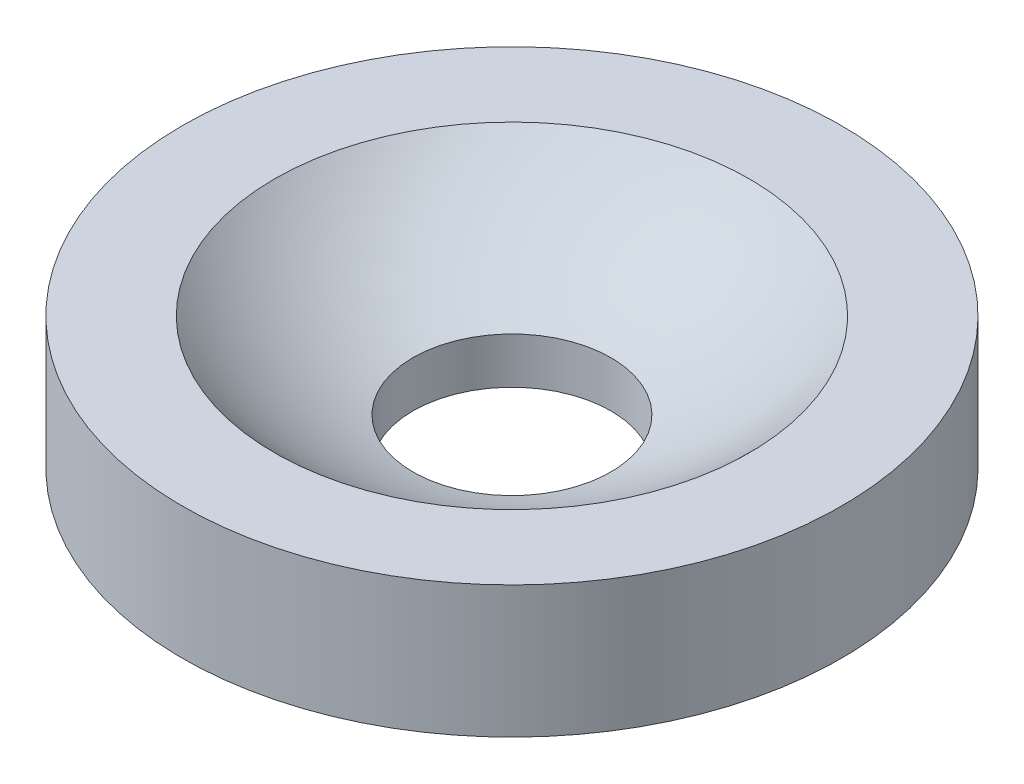
ISO-10303-21;
HEADER;
FILE_DESCRIPTION(('STEP AP214'),'2;1');
FILE_NAME('part.step','',(''),(''),'','','');
FILE_SCHEMA(('AUTOMOTIVE_DESIGN { 1 0 10303 214 1 1 1 1 }'));
ENDSEC;
DATA;
#1=APPLICATION_CONTEXT('core data for automotive mechanical design processes');
#2=APPLICATION_PROTOCOL_DEFINITION('international standard','automotive_design',2000,#1);
#3=PRODUCT_CONTEXT('',#1,'mechanical');
#4=PRODUCT('Part','Part','',(#3));
#5=PRODUCT_RELATED_PRODUCT_CATEGORY('part','',(#4));
#6=PRODUCT_DEFINITION_FORMATION('','',#4);
#7=PRODUCT_DEFINITION_CONTEXT('part definition',#1,'design');
#8=PRODUCT_DEFINITION('design','',#6,#7);
#9=PRODUCT_DEFINITION_SHAPE('','',#8);
#10=(LENGTH_UNIT() NAMED_UNIT(*) SI_UNIT(.MILLI.,.METRE.));
#11=(NAMED_UNIT(*) PLANE_ANGLE_UNIT() SI_UNIT($,.RADIAN.));
#12=(NAMED_UNIT(*) SI_UNIT($,.STERADIAN.) SOLID_ANGLE_UNIT());
#13=UNCERTAINTY_MEASURE_WITH_UNIT(LENGTH_MEASURE(1.E-05),#10,'distance_accuracy_value','');
#14=(GEOMETRIC_REPRESENTATION_CONTEXT(3) GLOBAL_UNCERTAINTY_ASSIGNED_CONTEXT((#13)) GLOBAL_UNIT_ASSIGNED_CONTEXT((#10,
#11,#12)) REPRESENTATION_CONTEXT('',''));
#15=CARTESIAN_POINT('',(0.,0.,0.));
#16=DIRECTION('',(0.,0.,1.));
#17=DIRECTION('',(1.,0.,0.));
#18=AXIS2_PLACEMENT_3D('',#15,#16,#17);
#19=CARTESIAN_POINT('',(3.5,2.,0.));
#20=DIRECTION('',(0.,-1.,0.));
#21=DIRECTION('',(1.,0.,0.));
#22=AXIS2_PLACEMENT_3D('',#19,#20,#21);
#23=PLANE('',#22);
#24=CARTESIAN_POINT('',(0.,2.,0.));
#25=DIRECTION('',(0.,-1.,0.));
#26=DIRECTION('',(1.,0.,0.));
#27=AXIS2_PLACEMENT_3D('',#24,#25,#26);
#28=CIRCLE('',#27,3.60080887005454);
#29=CARTESIAN_POINT('',(-3.60080887005454,2.,0.));
#30=VERTEX_POINT('',#29);
#31=EDGE_CURVE('E49',#30,#30,#28,.T.);
#32=ORIENTED_EDGE('',*,*,#31,.T.);
#33=EDGE_LOOP('',(#32));
#34=FACE_BOUND('',#33,.T.);
#35=CARTESIAN_POINT('',(0.,2.,0.));
#36=DIRECTION('',(0.,1.,0.));
#37=DIRECTION('',(-1.,0.,0.));
#38=AXIS2_PLACEMENT_3D('',#35,#36,#37);
#39=CIRCLE('',#38,5.);
#40=CARTESIAN_POINT('',(-5.,2.,0.));
#41=VERTEX_POINT('',#40);
#42=EDGE_CURVE('E10',#41,#41,#39,.T.);
#43=ORIENTED_EDGE('',*,*,#42,.T.);
#44=EDGE_LOOP('',(#43));
#45=FACE_BOUND('',#44,.T.);
#46=ADVANCED_FACE('F35',(#34,#45),#23,.F.);
#47=CARTESIAN_POINT('',(0.,0.,0.));
#48=DIRECTION('',(0.,1.,0.));
#49=DIRECTION('',(-1.,0.,0.));
#50=AXIS2_PLACEMENT_3D('',#47,#48,#49);
#51=CYLINDRICAL_SURFACE('',#50,5.);
#52=ORIENTED_EDGE('',*,*,#42,.F.);
#53=EDGE_LOOP('',(#52));
#54=FACE_BOUND('',#53,.T.);
#55=CARTESIAN_POINT('',(0.,0.,0.));
#56=DIRECTION('',(0.,1.,0.));
#57=DIRECTION('',(-1.,0.,0.));
#58=AXIS2_PLACEMENT_3D('',#55,#56,#57);
#59=CIRCLE('',#58,5.);
#60=CARTESIAN_POINT('',(-5.,0.,0.));
#61=VERTEX_POINT('',#60);
#62=EDGE_CURVE('E41',#61,#61,#59,.T.);
#63=ORIENTED_EDGE('',*,*,#62,.T.);
#64=EDGE_LOOP('',(#63));
#65=FACE_BOUND('',#64,.T.);
#66=ADVANCED_FACE('F67',(#54,#65),#51,.T.);
#67=CARTESIAN_POINT('',(5.,0.,0.));
#68=DIRECTION('',(0.,1.,0.));
#69=DIRECTION('',(-1.,0.,0.));
#70=AXIS2_PLACEMENT_3D('',#67,#68,#69);
#71=PLANE('',#70);
#72=ORIENTED_EDGE('',*,*,#62,.F.);
#73=EDGE_LOOP('',(#72));
#74=FACE_BOUND('',#73,.T.);
#75=CARTESIAN_POINT('',(0.,0.,0.));
#76=DIRECTION('',(0.,1.,0.));
#77=DIRECTION('',(-1.,0.,0.));
#78=AXIS2_PLACEMENT_3D('',#75,#76,#77);
#79=CIRCLE('',#78,1.50211322563244);
#80=CARTESIAN_POINT('',(-1.50211322563244,0.,0.));
#81=VERTEX_POINT('',#80);
#82=EDGE_CURVE('E45',#81,#81,#79,.T.);
#83=ORIENTED_EDGE('',*,*,#82,.T.);
#84=EDGE_LOOP('',(#83));
#85=FACE_BOUND('',#84,.T.);
#86=ADVANCED_FACE('F71',(#74,#85),#71,.F.);
#87=CARTESIAN_POINT('',(0.,0.,0.));
#88=DIRECTION('',(0.,1.,0.));
#89=DIRECTION('',(-1.,0.,0.));
#90=AXIS2_PLACEMENT_3D('',#87,#88,#89);
#91=CYLINDRICAL_SURFACE('',#90,1.50211322563244);
#92=ORIENTED_EDGE('',*,*,#82,.F.);
#93=EDGE_LOOP('',(#92));
#94=FACE_BOUND('',#93,.T.);
#95=CARTESIAN_POINT('',(0.,0.7,0.));
#96=DIRECTION('',(0.,1.,0.));
#97=DIRECTION('',(-1.,0.,0.));
#98=AXIS2_PLACEMENT_3D('',#95,#96,#97);
#99=CIRCLE('',#98,1.50211322563244);
#100=CARTESIAN_POINT('',(-1.50211322563244,0.7,0.));
#101=VERTEX_POINT('',#100);
#102=EDGE_CURVE('E54',#101,#101,#99,.T.);
#103=ORIENTED_EDGE('',*,*,#102,.T.);
#104=EDGE_LOOP('',(#103));
#105=FACE_BOUND('',#104,.T.);
#106=ADVANCED_FACE('F58',(#94,#105),#91,.F.);
#107=CARTESIAN_POINT('',(0.,5.46903091386291,0.));
#108=DIRECTION('',(0.,-1.,0.));
#109=DIRECTION('',(-1.,0.,0.));
#110=AXIS2_PLACEMENT_3D('',#107,#108,#109);
#111=SPHERICAL_SURFACE('',#110,5.);
#112=CARTESIAN_POINT('',(-1.50211322563244,0.7,0.));
#113=CARTESIAN_POINT('',(-1.52689727492986,0.707806273541183,0.));
#114=CARTESIAN_POINT('',(-1.55162046090147,0.715805779316901,0.));
#115=CARTESIAN_POINT('',(-1.60093912139826,0.732189237261059,0.));
#116=CARTESIAN_POINT('',(-1.62553459592343,0.7405731894295,0.));
#117=CARTESIAN_POINT('',(-1.67459184873251,0.757723522082758,0.));
#118=CARTESIAN_POINT('',(-1.69905362701642,0.766489902567576,0.));
#119=CARTESIAN_POINT('',(-1.7478375433623,0.784402955784933,0.));
#120=CARTESIAN_POINT('',(-1.77215968142428,0.793549628517473,0.));
#121=CARTESIAN_POINT('',(-1.82065840505821,0.812221044435887,0.));
#122=CARTESIAN_POINT('',(-1.84483499063018,0.821745787621761,0.));
#123=CARTESIAN_POINT('',(-1.89303673299153,0.84117102896007,0.));
#124=CARTESIAN_POINT('',(-1.91706188978092,0.851071527112504,0.));
#125=CARTESIAN_POINT('',(-1.96495493493119,0.871245872046947,0.));
#126=CARTESIAN_POINT('',(-1.98882282329207,0.881519718828954,0.));
#127=CARTESIAN_POINT('',(-2.0363955302083,0.902438263809474,0.));
#128=CARTESIAN_POINT('',(-2.06010034876365,0.913082962007987,0.));
#129=CARTESIAN_POINT('',(-2.10734115431645,0.934740622503,0.));
#130=CARTESIAN_POINT('',(-2.1308771413139,0.945753584799501,0.));
#131=CARTESIAN_POINT('',(-2.17777456303821,0.968145096651554,0.));
#132=CARTESIAN_POINT('',(-2.20113599776507,0.979523646207106,0.));
#133=CARTESIAN_POINT('',(-2.24767863666178,1.0026435668803,0.));
#134=CARTESIAN_POINT('',(-2.27085984083164,1.01438493799793,0.));
#135=CARTESIAN_POINT('',(-2.3170363841354,1.03822764790938,0.));
#136=CARTESIAN_POINT('',(-2.34003172326931,1.05032898670318,0.));
#137=CARTESIAN_POINT('',(-2.38583094719901,1.07488869058664,0.));
#138=CARTESIAN_POINT('',(-2.40863483199479,1.08734705567628,0.));
#139=CARTESIAN_POINT('',(-2.45404560448141,1.11261778399135,0.));
#140=CARTESIAN_POINT('',(-2.47665249217224,1.12543014721678,0.));
#141=CARTESIAN_POINT('',(-2.52166377556472,1.15140575759974,0.));
#142=CARTESIAN_POINT('',(-2.54406817126636,1.16456900475728,0.));
#143=CARTESIAN_POINT('',(-2.58866902501441,1.1912431835141,0.));
#144=CARTESIAN_POINT('',(-2.61086548306081,1.20475411511339,0.));
#145=CARTESIAN_POINT('',(-2.65504506637415,1.23212037875432,0.));
#146=CARTESIAN_POINT('',(-2.67702819164108,1.24597571079597,0.));
#147=CARTESIAN_POINT('',(-2.72077576612444,1.27402740761148,0.));
#148=CARTESIAN_POINT('',(-2.74254021534085,1.28822377238532,0.));
#149=CARTESIAN_POINT('',(-2.78584514760405,1.31695408406281,0.));
#150=CARTESIAN_POINT('',(-2.80738563065082,1.33148803096645,0.));
#151=CARTESIAN_POINT('',(-2.85023739489336,1.3608899742476,0.));
#152=CARTESIAN_POINT('',(-2.87154867608912,1.3757579706251,0.));
#153=CARTESIAN_POINT('',(-2.91393685665859,1.40582439900319,0.));
#154=CARTESIAN_POINT('',(-2.93501375603231,1.42102283100378,0.));
#155=CARTESIAN_POINT('',(-2.97692804995611,1.45174643646074,0.));
#156=CARTESIAN_POINT('',(-2.99776544450619,1.46727160991711,0.));
#157=CARTESIAN_POINT('',(-3.03919566399563,1.49864492469993,0.));
#158=CARTESIAN_POINT('',(-3.05978848893498,1.51449306602637,0.));
#159=CARTESIAN_POINT('',(-3.100724563862,1.54650846446177,0.));
#160=CARTESIAN_POINT('',(-3.12106781384968,1.56267572157073,0.));
#161=CARTESIAN_POINT('',(-3.16149979419287,1.59532542192039,0.));
#162=CARTESIAN_POINT('',(-3.18158852454838,1.6118078651611,0.));
#163=CARTESIAN_POINT('',(-3.2215065828178,1.64508393150673,0.));
#164=CARTESIAN_POINT('',(-3.24133591073171,1.66187755461166,0.));
#165=CARTESIAN_POINT('',(-3.28073034433363,1.69577189880774,0.));
#166=CARTESIAN_POINT('',(-3.30029545002165,1.71287261989891,0.));
#167=CARTESIAN_POINT('',(-3.33915668370645,1.74737700344966,0.));
#168=CARTESIAN_POINT('',(-3.35845281170322,1.76478066590925,0.));
#169=CARTESIAN_POINT('',(-3.39677139955856,1.79988670230319,0.));
#170=CARTESIAN_POINT('',(-3.41579385941711,1.81758907623754,0.));
#171=CARTESIAN_POINT('',(-3.45356048841098,1.85328823174645,0.));
#172=CARTESIAN_POINT('',(-3.47230465754629,1.87128501332101,0.));
#173=CARTESIAN_POINT('',(-3.50951014513655,1.90756861370001,0.));
#174=CARTESIAN_POINT('',(-3.52797146359149,1.92585543250445,0.));
#175=CARTESIAN_POINT('',(-3.56460677732715,1.96271464783651,0.));
#176=CARTESIAN_POINT('',(-3.58278077260787,1.98128704436413,0.));
#177=CARTESIAN_POINT('',(-3.60080887005454,2.,0.));
#178=B_SPLINE_CURVE_WITH_KNOTS('',3,(#112,#113,#114,#115,#116,#117,#118,#119,#120,#121,#122,
#123,#124,#125,#126,#127,#128,#129,#130,#131,#132,#133,#134,#135,#136,#137,#138,#139,#140,#141,
#142,#143,#144,#145,#146,#147,#148,#149,#150,#151,#152,#153,#154,#155,#156,#157,#158,#159,#160,
#161,#162,#163,#164,#165,#166,#167,#168,#169,#170,#171,#172,#173,#174,#175,#176,#177),
.UNSPECIFIED.,.F.,.F.,(4,2,2,2,2,2,2,2,2,2,2,2,2,2,2,2,2,2,2,2,2,2,2,2,2,2,2,2,2,2,2,2,4),(0.,
0.0779522921069703,0.155904584213942,0.233856876320912,0.311809168427883,0.389761460534854,
0.467713752641825,0.545666044748796,0.623618336855767,0.701570628962737,0.779522921069709,
0.857475213176679,0.935427505283651,1.01337979739062,1.09133208949759,1.16928438160456,
1.24723667371153,1.3251889658185,1.40314125792548,1.48109355003245,1.55904584213942,
1.63699813424639,1.71495042635336,1.79290271846033,1.8708550105673,1.94880730267427,
2.02675959478124,2.10471188688821,2.18266417899518,2.26061647110215,2.33856876320913,
2.4165210553161,2.49447334742307),.UNSPECIFIED.);
#179=EDGE_CURVE('BSEAM60',#101,#30,#178,.T.);
#180=ORIENTED_EDGE('',*,*,#102,.F.);
#181=ORIENTED_EDGE('',*,*,#31,.F.);
#182=ORIENTED_EDGE('',*,*,#179,.T.);
#183=ORIENTED_EDGE('',*,*,#179,.F.);
#184=EDGE_LOOP('',(#180,#182,#181,#183));
#185=FACE_BOUND('',#184,.T.);
#186=ADVANCED_FACE('F60',(#185),#111,.F.);
#187=CLOSED_SHELL('',(#46,#66,#86,#106,#186));
#188=MANIFOLD_SOLID_BREP('B2',#187);
#189=ADVANCED_BREP_SHAPE_REPRESENTATION('',(#18,#188),#14);
#190=SHAPE_DEFINITION_REPRESENTATION(#9,#189);
ENDSEC;
END-ISO-10303-21;
